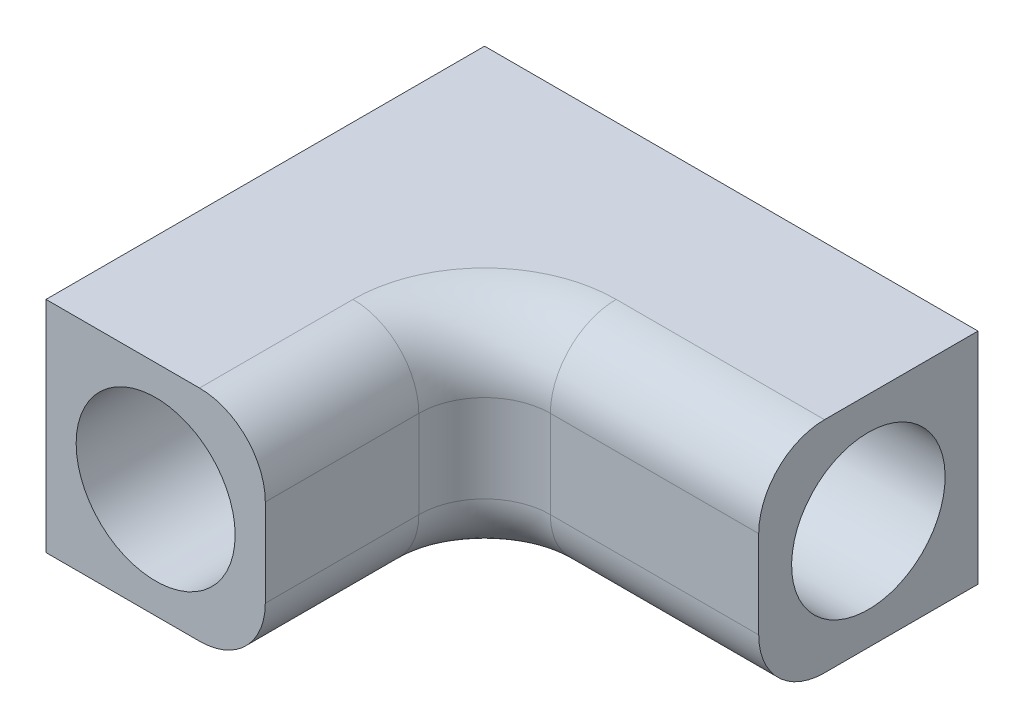
ISO-10303-21;
HEADER;
FILE_DESCRIPTION(('STEP AP214'),'2;1');
FILE_NAME('part.step','',(''),(''),'','','');
FILE_SCHEMA(('AUTOMOTIVE_DESIGN { 1 0 10303 214 1 1 1 1 }'));
ENDSEC;
DATA;
#1=APPLICATION_CONTEXT('core data for automotive mechanical design processes');
#2=APPLICATION_PROTOCOL_DEFINITION('international standard','automotive_design',2000,#1);
#3=PRODUCT_CONTEXT('',#1,'mechanical');
#4=PRODUCT('Part','Part','',(#3));
#5=PRODUCT_RELATED_PRODUCT_CATEGORY('part','',(#4));
#6=PRODUCT_DEFINITION_FORMATION('','',#4);
#7=PRODUCT_DEFINITION_CONTEXT('part definition',#1,'design');
#8=PRODUCT_DEFINITION('design','',#6,#7);
#9=PRODUCT_DEFINITION_SHAPE('','',#8);
#10=(LENGTH_UNIT() NAMED_UNIT(*) SI_UNIT(.MILLI.,.METRE.));
#11=(NAMED_UNIT(*) PLANE_ANGLE_UNIT() SI_UNIT($,.RADIAN.));
#12=(NAMED_UNIT(*) SI_UNIT($,.STERADIAN.) SOLID_ANGLE_UNIT());
#13=UNCERTAINTY_MEASURE_WITH_UNIT(LENGTH_MEASURE(1.E-05),#10,'distance_accuracy_value','');
#14=(GEOMETRIC_REPRESENTATION_CONTEXT(3) GLOBAL_UNCERTAINTY_ASSIGNED_CONTEXT((#13)) GLOBAL_UNIT_ASSIGNED_CONTEXT((#10,
#11,#12)) REPRESENTATION_CONTEXT('',''));
#15=CARTESIAN_POINT('',(0.,0.,0.));
#16=DIRECTION('',(0.,0.,1.));
#17=DIRECTION('',(1.,0.,0.));
#18=AXIS2_PLACEMENT_3D('',#15,#16,#17);
#19=CARTESIAN_POINT('',(-26.9705627484772,0.,10.));
#20=DIRECTION('',(1.,0.,0.));
#21=DIRECTION('',(0.,1.,0.));
#22=AXIS2_PLACEMENT_3D('',#19,#20,#21);
#23=CYLINDRICAL_SURFACE('',#22,6.);
#24=CARTESIAN_POINT('',(-9.,0.,10.));
#25=DIRECTION('',(1.,0.,0.));
#26=DIRECTION('',(0.,1.,0.));
#27=AXIS2_PLACEMENT_3D('',#24,#25,#26);
#28=CIRCLE('',#27,6.);
#29=CARTESIAN_POINT('',(-9.,6.,10.));
#30=VERTEX_POINT('',#29);
#31=EDGE_CURVE('E134',#30,#30,#28,.F.);
#32=ORIENTED_EDGE('',*,*,#31,.T.);
#33=EDGE_LOOP('',(#32));
#34=FACE_BOUND('',#33,.T.);
#35=CARTESIAN_POINT('',(0.,0.,10.));
#36=DIRECTION('',(-0.707106781186547,0.,0.707106781186548));
#37=DIRECTION('',(0.707106781186547,0.,0.707106781186548));
#38=AXIS2_PLACEMENT_3D('',#35,#36,#37);
#39=ELLIPSE('',#38,8.48528137423857,6.);
#40=CARTESIAN_POINT('',(0.,6.,10.));
#41=VERTEX_POINT('',#40);
#42=CARTESIAN_POINT('',(0.,-6.,10.));
#43=VERTEX_POINT('',#42);
#44=EDGE_CURVE('E125',#41,#43,#39,.F.);
#45=ORIENTED_EDGE('',*,*,#44,.F.);
#46=CARTESIAN_POINT('',(0.,0.,10.));
#47=DIRECTION('',(0.707106781186547,0.,0.707106781186548));
#48=DIRECTION('',(-0.707106781186547,0.,0.707106781186548));
#49=AXIS2_PLACEMENT_3D('',#46,#47,#48);
#50=ELLIPSE('',#49,8.48528137423857,6.);
#51=EDGE_CURVE('E129',#43,#41,#50,.F.);
#52=ORIENTED_EDGE('',*,*,#51,.F.);
#53=EDGE_LOOP('',(#45,#52));
#54=FACE_BOUND('',#53,.T.);
#55=CARTESIAN_POINT('',(15.,0.,10.));
#56=DIRECTION('',(1.,0.,0.));
#57=DIRECTION('',(0.,1.,0.));
#58=AXIS2_PLACEMENT_3D('',#55,#56,#57);
#59=CIRCLE('',#58,6.);
#60=CARTESIAN_POINT('',(15.,6.,10.));
#61=VERTEX_POINT('',#60);
#62=EDGE_CURVE('E180',#61,#61,#59,.F.);
#63=ORIENTED_EDGE('',*,*,#62,.F.);
#64=EDGE_LOOP('',(#63));
#65=FACE_BOUND('',#64,.T.);
#66=ADVANCED_FACE('F37',(#34,#54,#65),#23,.F.);
#67=CARTESIAN_POINT('',(0.,0.,-0.001000000000001));
#68=DIRECTION('',(0.,0.,1.));
#69=DIRECTION('',(1.,0.,0.));
#70=AXIS2_PLACEMENT_3D('',#67,#68,#69);
#71=CYLINDRICAL_SURFACE('',#70,6.);
#72=ORIENTED_EDGE('',*,*,#51,.T.);
#73=ORIENTED_EDGE('',*,*,#44,.T.);
#74=EDGE_LOOP('',(#72,#73));
#75=FACE_BOUND('',#74,.T.);
#76=CARTESIAN_POINT('',(0.,0.,20.));
#77=DIRECTION('',(0.,0.,1.));
#78=DIRECTION('',(1.,0.,0.));
#79=AXIS2_PLACEMENT_3D('',#76,#77,#78);
#80=CIRCLE('',#79,6.);
#81=CARTESIAN_POINT('',(6.,0.,20.));
#82=VERTEX_POINT('',#81);
#83=EDGE_CURVE('E131',#82,#82,#80,.F.);
#84=ORIENTED_EDGE('',*,*,#83,.F.);
#85=EDGE_LOOP('',(#84));
#86=FACE_BOUND('',#85,.T.);
#87=ADVANCED_FACE('F127',(#75,#86),#71,.F.);
#88=CARTESIAN_POINT('',(10.,10.,40.));
#89=DIRECTION('',(-1.,0.,0.));
#90=DIRECTION('',(0.,-1.,0.));
#91=AXIS2_PLACEMENT_3D('',#88,#89,#90);
#92=PLANE('',#91);
#93=DIRECTION('',(0.,-1.,0.));
#94=VECTOR('',#93,1.);
#95=CARTESIAN_POINT('',(10.,9.99999999999999,26.));
#96=LINE('',#95,#94);
#97=CARTESIAN_POINT('',(10.,-4.,26.));
#98=VERTEX_POINT('',#97);
#99=CARTESIAN_POINT('',(10.,4.,26.));
#100=VERTEX_POINT('',#99);
#101=EDGE_CURVE('E192',#98,#100,#96,.F.);
#102=ORIENTED_EDGE('',*,*,#101,.T.);
#103=DIRECTION('',(0.,0.,-1.));
#104=VECTOR('',#103,1.);
#105=CARTESIAN_POINT('',(10.,4.,40.));
#106=LINE('',#105,#104);
#107=CARTESIAN_POINT('',(10.,4.,40.));
#108=VERTEX_POINT('',#107);
#109=EDGE_CURVE('E194',#100,#108,#106,.F.);
#110=ORIENTED_EDGE('',*,*,#109,.T.);
#111=DIRECTION('',(0.,1.,0.));
#112=VECTOR('',#111,1.);
#113=CARTESIAN_POINT('',(10.,10.,40.));
#114=LINE('',#113,#112);
#115=CARTESIAN_POINT('',(10.,-4.,40.));
#116=VERTEX_POINT('',#115);
#117=EDGE_CURVE('E154',#116,#108,#114,.T.);
#118=ORIENTED_EDGE('',*,*,#117,.F.);
#119=DIRECTION('',(0.,0.,-1.));
#120=VECTOR('',#119,1.);
#121=CARTESIAN_POINT('',(10.,-4.,40.));
#122=LINE('',#121,#120);
#123=EDGE_CURVE('E190',#116,#98,#122,.T.);
#124=ORIENTED_EDGE('',*,*,#123,.T.);
#125=EDGE_LOOP('',(#102,#110,#118,#124));
#126=FACE_BOUND('',#125,.T.);
#127=ADVANCED_FACE('F288',(#126),#92,.F.);
#128=CARTESIAN_POINT('',(-10.,10.,40.));
#129=DIRECTION('',(0.,-1.,0.));
#130=DIRECTION('',(0.,0.,-1.));
#131=AXIS2_PLACEMENT_3D('',#128,#129,#130);
#132=PLANE('',#131);
#133=DIRECTION('',(-1.,0.,0.));
#134=VECTOR('',#133,1.);
#135=CARTESIAN_POINT('',(-10.,10.,40.));
#136=LINE('',#135,#134);
#137=CARTESIAN_POINT('',(4.,10.,40.));
#138=VERTEX_POINT('',#137);
#139=CARTESIAN_POINT('',(-10.,10.,40.));
#140=VERTEX_POINT('',#139);
#141=EDGE_CURVE('E157',#138,#140,#136,.T.);
#142=ORIENTED_EDGE('',*,*,#141,.F.);
#143=DIRECTION('',(0.,0.,-1.));
#144=VECTOR('',#143,1.);
#145=CARTESIAN_POINT('',(4.,10.,40.));
#146=LINE('',#145,#144);
#147=CARTESIAN_POINT('',(4.,10.,26.));
#148=VERTEX_POINT('',#147);
#149=EDGE_CURVE('E201',#138,#148,#146,.T.);
#150=ORIENTED_EDGE('',*,*,#149,.T.);
#151=CARTESIAN_POINT('',(16.,10.,26.));
#152=DIRECTION('',(0.,-1.,0.));
#153=DIRECTION('',(0.,0.,-1.));
#154=AXIS2_PLACEMENT_3D('',#151,#152,#153);
#155=CIRCLE('',#154,12.);
#156=CARTESIAN_POINT('',(16.,10.,14.));
#157=VERTEX_POINT('',#156);
#158=EDGE_CURVE('E198',#157,#148,#155,.F.);
#159=ORIENTED_EDGE('',*,*,#158,.F.);
#160=DIRECTION('',(-1.,0.,0.));
#161=VECTOR('',#160,1.);
#162=CARTESIAN_POINT('',(-10.,10.,14.));
#163=LINE('',#162,#161);
#164=CARTESIAN_POINT('',(35.,10.,14.));
#165=VERTEX_POINT('',#164);
#166=EDGE_CURVE('E196',#157,#165,#163,.F.);
#167=ORIENTED_EDGE('',*,*,#166,.T.);
#168=DIRECTION('',(0.,0.,1.));
#169=VECTOR('',#168,1.);
#170=CARTESIAN_POINT('',(35.,10.,20.));
#171=LINE('',#170,#169);
#172=CARTESIAN_POINT('',(35.,10.,0.));
#173=VERTEX_POINT('',#172);
#174=EDGE_CURVE('E145',#173,#165,#171,.T.);
#175=ORIENTED_EDGE('',*,*,#174,.F.);
#176=DIRECTION('',(-1.,0.,0.));
#177=VECTOR('',#176,1.);
#178=CARTESIAN_POINT('',(-10.,10.,0.));
#179=LINE('',#178,#177);
#180=CARTESIAN_POINT('',(-10.,10.,0.));
#181=VERTEX_POINT('',#180);
#182=EDGE_CURVE('E153',#173,#181,#179,.T.);
#183=ORIENTED_EDGE('',*,*,#182,.T.);
#184=DIRECTION('',(0.,0.,-1.));
#185=VECTOR('',#184,1.);
#186=CARTESIAN_POINT('',(-10.,10.,40.));
#187=LINE('',#186,#185);
#188=EDGE_CURVE('E173',#140,#181,#187,.T.);
#189=ORIENTED_EDGE('',*,*,#188,.F.);
#190=EDGE_LOOP('',(#142,#150,#159,#167,#175,#183,#189));
#191=FACE_BOUND('',#190,.T.);
#192=ADVANCED_FACE('F267',(#191),#132,.F.);
#193=CARTESIAN_POINT('',(-10.,10.,40.));
#194=DIRECTION('',(1.,0.,0.));
#195=DIRECTION('',(0.,1.,0.));
#196=AXIS2_PLACEMENT_3D('',#193,#194,#195);
#197=PLANE('',#196);
#198=CARTESIAN_POINT('',(-10.,0.,10.));
#199=DIRECTION('',(-1.,0.,0.));
#200=DIRECTION('',(0.,-1.,0.));
#201=AXIS2_PLACEMENT_3D('',#198,#199,#200);
#202=CIRCLE('',#201,4.);
#203=CARTESIAN_POINT('',(-10.,-4.,10.));
#204=VERTEX_POINT('',#203);
#205=EDGE_CURVE('E229',#204,#204,#202,.T.);
#206=ORIENTED_EDGE('',*,*,#205,.F.);
#207=EDGE_LOOP('',(#206));
#208=FACE_BOUND('',#207,.T.);
#209=DIRECTION('',(0.,-1.,0.));
#210=VECTOR('',#209,1.);
#211=CARTESIAN_POINT('',(-10.,10.,0.));
#212=LINE('',#211,#210);
#213=CARTESIAN_POINT('',(-10.,-10.,0.));
#214=VERTEX_POINT('',#213);
#215=EDGE_CURVE('E167',#181,#214,#212,.T.);
#216=ORIENTED_EDGE('',*,*,#215,.T.);
#217=DIRECTION('',(0.,0.,-1.));
#218=VECTOR('',#217,1.);
#219=CARTESIAN_POINT('',(-10.,-10.,40.));
#220=LINE('',#219,#218);
#221=CARTESIAN_POINT('',(-10.,-10.,40.));
#222=VERTEX_POINT('',#221);
#223=EDGE_CURVE('E165',#222,#214,#220,.T.);
#224=ORIENTED_EDGE('',*,*,#223,.F.);
#225=DIRECTION('',(0.,-1.,0.));
#226=VECTOR('',#225,1.);
#227=CARTESIAN_POINT('',(-10.,10.,40.));
#228=LINE('',#227,#226);
#229=EDGE_CURVE('E160',#140,#222,#228,.T.);
#230=ORIENTED_EDGE('',*,*,#229,.F.);
#231=ORIENTED_EDGE('',*,*,#188,.T.);
#232=EDGE_LOOP('',(#216,#224,#230,#231));
#233=FACE_BOUND('',#232,.T.);
#234=ADVANCED_FACE('F274',(#208,#233),#197,.F.);
#235=CARTESIAN_POINT('',(-10.,-10.,40.));
#236=DIRECTION('',(0.,1.,0.));
#237=DIRECTION('',(0.,0.,1.));
#238=AXIS2_PLACEMENT_3D('',#235,#236,#237);
#239=PLANE('',#238);
#240=CARTESIAN_POINT('',(16.,-10.,26.));
#241=DIRECTION('',(0.,1.,0.));
#242=DIRECTION('',(0.,0.,1.));
#243=AXIS2_PLACEMENT_3D('',#240,#241,#242);
#244=CIRCLE('',#243,12.);
#245=CARTESIAN_POINT('',(4.,-10.,26.));
#246=VERTEX_POINT('',#245);
#247=CARTESIAN_POINT('',(16.,-10.,14.));
#248=VERTEX_POINT('',#247);
#249=EDGE_CURVE('E57',#246,#248,#244,.F.);
#250=ORIENTED_EDGE('',*,*,#249,.F.);
#251=DIRECTION('',(0.,0.,-1.));
#252=VECTOR('',#251,1.);
#253=CARTESIAN_POINT('',(4.,-10.,40.));
#254=LINE('',#253,#252);
#255=CARTESIAN_POINT('',(4.,-10.,40.));
#256=VERTEX_POINT('',#255);
#257=EDGE_CURVE('E209',#246,#256,#254,.F.);
#258=ORIENTED_EDGE('',*,*,#257,.T.);
#259=DIRECTION('',(1.,0.,0.));
#260=VECTOR('',#259,1.);
#261=CARTESIAN_POINT('',(-10.,-10.,40.));
#262=LINE('',#261,#260);
#263=EDGE_CURVE('E162',#222,#256,#262,.T.);
#264=ORIENTED_EDGE('',*,*,#263,.F.);
#265=ORIENTED_EDGE('',*,*,#223,.T.);
#266=DIRECTION('',(1.,0.,0.));
#267=VECTOR('',#266,1.);
#268=CARTESIAN_POINT('',(-10.,-10.,0.));
#269=LINE('',#268,#267);
#270=CARTESIAN_POINT('',(35.,-10.,0.));
#271=VERTEX_POINT('',#270);
#272=EDGE_CURVE('E158',#214,#271,#269,.T.);
#273=ORIENTED_EDGE('',*,*,#272,.T.);
#274=DIRECTION('',(0.,0.,-1.));
#275=VECTOR('',#274,1.);
#276=CARTESIAN_POINT('',(35.,-10.,20.));
#277=LINE('',#276,#275);
#278=CARTESIAN_POINT('',(35.,-10.,14.));
#279=VERTEX_POINT('',#278);
#280=EDGE_CURVE('E151',#279,#271,#277,.T.);
#281=ORIENTED_EDGE('',*,*,#280,.F.);
#282=DIRECTION('',(-1.,0.,0.));
#283=VECTOR('',#282,1.);
#284=CARTESIAN_POINT('',(-10.,-10.,14.));
#285=LINE('',#284,#283);
#286=EDGE_CURVE('E52',#279,#248,#285,.T.);
#287=ORIENTED_EDGE('',*,*,#286,.T.);
#288=EDGE_LOOP('',(#250,#258,#264,#265,#273,#281,#287));
#289=FACE_BOUND('',#288,.T.);
#290=ADVANCED_FACE('F254',(#289),#239,.F.);
#291=CARTESIAN_POINT('',(0.,0.,40.));
#292=DIRECTION('',(0.,0.,1.));
#293=DIRECTION('',(1.,0.,0.));
#294=AXIS2_PLACEMENT_3D('',#291,#292,#293);
#295=PLANE('',#294);
#296=CARTESIAN_POINT('',(0.,0.,40.));
#297=DIRECTION('',(0.,0.,1.));
#298=DIRECTION('',(1.,0.,0.));
#299=AXIS2_PLACEMENT_3D('',#296,#297,#298);
#300=CIRCLE('',#299,7.25);
#301=CARTESIAN_POINT('',(7.25,0.,40.));
#302=VERTEX_POINT('',#301);
#303=EDGE_CURVE('E140',#302,#302,#300,.T.);
#304=ORIENTED_EDGE('',*,*,#303,.F.);
#305=EDGE_LOOP('',(#304));
#306=FACE_BOUND('',#305,.T.);
#307=ORIENTED_EDGE('',*,*,#117,.T.);
#308=CARTESIAN_POINT('',(4.,4.,40.));
#309=DIRECTION('',(0.,0.,1.));
#310=DIRECTION('',(1.,0.,0.));
#311=AXIS2_PLACEMENT_3D('',#308,#309,#310);
#312=CIRCLE('',#311,6.);
#313=EDGE_CURVE('E205',#108,#138,#312,.T.);
#314=ORIENTED_EDGE('',*,*,#313,.T.);
#315=ORIENTED_EDGE('',*,*,#141,.T.);
#316=ORIENTED_EDGE('',*,*,#229,.T.);
#317=ORIENTED_EDGE('',*,*,#263,.T.);
#318=CARTESIAN_POINT('',(4.,-4.,40.));
#319=DIRECTION('',(0.,0.,1.));
#320=DIRECTION('',(1.,0.,0.));
#321=AXIS2_PLACEMENT_3D('',#318,#319,#320);
#322=CIRCLE('',#321,6.);
#323=EDGE_CURVE('E203',#256,#116,#322,.T.);
#324=ORIENTED_EDGE('',*,*,#323,.T.);
#325=EDGE_LOOP('',(#307,#314,#315,#316,#317,#324));
#326=FACE_BOUND('',#325,.T.);
#327=ADVANCED_FACE('F250',(#306,#326),#295,.T.);
#328=CARTESIAN_POINT('',(0.,0.,0.));
#329=DIRECTION('',(0.,0.,1.));
#330=DIRECTION('',(1.,0.,0.));
#331=AXIS2_PLACEMENT_3D('',#328,#329,#330);
#332=PLANE('',#331);
#333=ORIENTED_EDGE('',*,*,#182,.F.);
#334=DIRECTION('',(0.,1.,0.));
#335=VECTOR('',#334,1.);
#336=CARTESIAN_POINT('',(35.,10.,0.));
#337=LINE('',#336,#335);
#338=EDGE_CURVE('E137',#271,#173,#337,.T.);
#339=ORIENTED_EDGE('',*,*,#338,.F.);
#340=ORIENTED_EDGE('',*,*,#272,.F.);
#341=ORIENTED_EDGE('',*,*,#215,.F.);
#342=EDGE_LOOP('',(#333,#339,#340,#341));
#343=FACE_BOUND('',#342,.T.);
#344=ADVANCED_FACE('F253',(#343),#332,.F.);
#345=CARTESIAN_POINT('',(35.,10.,20.));
#346=DIRECTION('',(0.,0.,-1.));
#347=DIRECTION('',(0.,1.,0.));
#348=AXIS2_PLACEMENT_3D('',#345,#346,#347);
#349=PLANE('',#348);
#350=DIRECTION('',(0.,-1.,0.));
#351=VECTOR('',#350,1.);
#352=CARTESIAN_POINT('',(16.,-10.,20.));
#353=LINE('',#352,#351);
#354=CARTESIAN_POINT('',(16.,4.,20.));
#355=VERTEX_POINT('',#354);
#356=CARTESIAN_POINT('',(16.,-4.,20.));
#357=VERTEX_POINT('',#356);
#358=EDGE_CURVE('E185',#355,#357,#353,.T.);
#359=ORIENTED_EDGE('',*,*,#358,.T.);
#360=DIRECTION('',(-1.,0.,0.));
#361=VECTOR('',#360,1.);
#362=CARTESIAN_POINT('',(35.,-4.,20.));
#363=LINE('',#362,#361);
#364=CARTESIAN_POINT('',(35.,-4.,20.));
#365=VERTEX_POINT('',#364);
#366=EDGE_CURVE('E188',#357,#365,#363,.F.);
#367=ORIENTED_EDGE('',*,*,#366,.T.);
#368=DIRECTION('',(0.,-1.,0.));
#369=VECTOR('',#368,1.);
#370=CARTESIAN_POINT('',(35.,10.,20.));
#371=LINE('',#370,#369);
#372=CARTESIAN_POINT('',(35.,4.,20.));
#373=VERTEX_POINT('',#372);
#374=EDGE_CURVE('E148',#373,#365,#371,.T.);
#375=ORIENTED_EDGE('',*,*,#374,.F.);
#376=DIRECTION('',(-1.,0.,0.));
#377=VECTOR('',#376,1.);
#378=CARTESIAN_POINT('',(35.,4.,20.));
#379=LINE('',#378,#377);
#380=EDGE_CURVE('E176',#373,#355,#379,.T.);
#381=ORIENTED_EDGE('',*,*,#380,.T.);
#382=EDGE_LOOP('',(#359,#367,#375,#381));
#383=FACE_BOUND('',#382,.T.);
#384=ADVANCED_FACE('F309',(#383),#349,.F.);
#385=CARTESIAN_POINT('',(35.,0.,0.));
#386=DIRECTION('',(1.,0.,0.));
#387=DIRECTION('',(0.,1.,0.));
#388=AXIS2_PLACEMENT_3D('',#385,#386,#387);
#389=PLANE('',#388);
#390=CARTESIAN_POINT('',(35.,0.,10.));
#391=DIRECTION('',(1.,0.,0.));
#392=DIRECTION('',(0.,1.,0.));
#393=AXIS2_PLACEMENT_3D('',#390,#391,#392);
#394=CIRCLE('',#393,7.);
#395=CARTESIAN_POINT('',(35.,7.00000000000001,10.));
#396=VERTEX_POINT('',#395);
#397=EDGE_CURVE('E234',#396,#396,#394,.T.);
#398=ORIENTED_EDGE('',*,*,#397,.F.);
#399=EDGE_LOOP('',(#398));
#400=FACE_BOUND('',#399,.T.);
#401=ORIENTED_EDGE('',*,*,#374,.T.);
#402=CARTESIAN_POINT('',(35.,-4.,14.));
#403=DIRECTION('',(1.,0.,0.));
#404=DIRECTION('',(0.,1.,0.));
#405=AXIS2_PLACEMENT_3D('',#402,#403,#404);
#406=CIRCLE('',#405,6.);
#407=EDGE_CURVE('E45',#365,#279,#406,.T.);
#408=ORIENTED_EDGE('',*,*,#407,.T.);
#409=ORIENTED_EDGE('',*,*,#280,.T.);
#410=ORIENTED_EDGE('',*,*,#338,.T.);
#411=ORIENTED_EDGE('',*,*,#174,.T.);
#412=CARTESIAN_POINT('',(35.,4.,14.));
#413=DIRECTION('',(1.,0.,0.));
#414=DIRECTION('',(0.,1.,0.));
#415=AXIS2_PLACEMENT_3D('',#412,#413,#414);
#416=CIRCLE('',#415,6.);
#417=EDGE_CURVE('E211',#165,#373,#416,.T.);
#418=ORIENTED_EDGE('',*,*,#417,.T.);
#419=EDGE_LOOP('',(#401,#408,#409,#410,#411,#418));
#420=FACE_BOUND('',#419,.T.);
#421=ADVANCED_FACE('F306',(#400,#420),#389,.T.);
#422=CARTESIAN_POINT('',(-9.,10.,40.));
#423=DIRECTION('',(1.,0.,0.));
#424=DIRECTION('',(0.,1.,0.));
#425=AXIS2_PLACEMENT_3D('',#422,#423,#424);
#426=PLANE('',#425);
#427=CARTESIAN_POINT('',(-9.,0.,10.));
#428=DIRECTION('',(1.,0.,0.));
#429=DIRECTION('',(0.,1.,0.));
#430=AXIS2_PLACEMENT_3D('',#427,#428,#429);
#431=CIRCLE('',#430,5.);
#432=CARTESIAN_POINT('',(-9.,5.,10.));
#433=VERTEX_POINT('',#432);
#434=EDGE_CURVE('E12',#433,#433,#431,.F.);
#435=ORIENTED_EDGE('',*,*,#434,.T.);
#436=EDGE_LOOP('',(#435));
#437=FACE_BOUND('',#436,.T.);
#438=ORIENTED_EDGE('',*,*,#31,.F.);
#439=EDGE_LOOP('',(#438));
#440=FACE_BOUND('',#439,.T.);
#441=ADVANCED_FACE('F305',(#437,#440),#426,.T.);
#442=CARTESIAN_POINT('',(0.,0.,20.));
#443=DIRECTION('',(0.,0.,1.));
#444=DIRECTION('',(1.,0.,0.));
#445=AXIS2_PLACEMENT_3D('',#442,#443,#444);
#446=PLANE('',#445);
#447=CARTESIAN_POINT('',(0.,0.,20.));
#448=DIRECTION('',(0.,0.,1.));
#449=DIRECTION('',(1.,0.,0.));
#450=AXIS2_PLACEMENT_3D('',#447,#448,#449);
#451=CIRCLE('',#450,7.25);
#452=CARTESIAN_POINT('',(7.25,0.,20.));
#453=VERTEX_POINT('',#452);
#454=EDGE_CURVE('E179',#453,#453,#451,.T.);
#455=ORIENTED_EDGE('',*,*,#454,.T.);
#456=EDGE_LOOP('',(#455));
#457=FACE_BOUND('',#456,.T.);
#458=ORIENTED_EDGE('',*,*,#83,.T.);
#459=EDGE_LOOP('',(#458));
#460=FACE_BOUND('',#459,.T.);
#461=ADVANCED_FACE('F354',(#457,#460),#446,.T.);
#462=CARTESIAN_POINT('',(0.,0.,20.));
#463=DIRECTION('',(0.,0.,1.));
#464=DIRECTION('',(1.,0.,0.));
#465=AXIS2_PLACEMENT_3D('',#462,#463,#464);
#466=CYLINDRICAL_SURFACE('',#465,7.25);
#467=ORIENTED_EDGE('',*,*,#454,.F.);
#468=EDGE_LOOP('',(#467));
#469=FACE_BOUND('',#468,.T.);
#470=ORIENTED_EDGE('',*,*,#303,.T.);
#471=EDGE_LOOP('',(#470));
#472=FACE_BOUND('',#471,.T.);
#473=ADVANCED_FACE('F248',(#469,#472),#466,.F.);
#474=CARTESIAN_POINT('',(15.,0.,10.));
#475=DIRECTION('',(1.,0.,0.));
#476=DIRECTION('',(0.,1.,0.));
#477=AXIS2_PLACEMENT_3D('',#474,#475,#476);
#478=PLANE('',#477);
#479=CARTESIAN_POINT('',(15.,0.,10.));
#480=DIRECTION('',(1.,0.,0.));
#481=DIRECTION('',(0.,1.,0.));
#482=AXIS2_PLACEMENT_3D('',#479,#480,#481);
#483=CIRCLE('',#482,7.);
#484=CARTESIAN_POINT('',(15.,7.,10.));
#485=VERTEX_POINT('',#484);
#486=EDGE_CURVE('E183',#485,#485,#483,.T.);
#487=ORIENTED_EDGE('',*,*,#486,.T.);
#488=EDGE_LOOP('',(#487));
#489=FACE_BOUND('',#488,.T.);
#490=ORIENTED_EDGE('',*,*,#62,.T.);
#491=EDGE_LOOP('',(#490));
#492=FACE_BOUND('',#491,.T.);
#493=ADVANCED_FACE('F369',(#489,#492),#478,.T.);
#494=CARTESIAN_POINT('',(15.,0.,10.));
#495=DIRECTION('',(1.,0.,0.));
#496=DIRECTION('',(0.,1.,0.));
#497=AXIS2_PLACEMENT_3D('',#494,#495,#496);
#498=CYLINDRICAL_SURFACE('',#497,7.);
#499=ORIENTED_EDGE('',*,*,#486,.F.);
#500=EDGE_LOOP('',(#499));
#501=FACE_BOUND('',#500,.T.);
#502=ORIENTED_EDGE('',*,*,#397,.T.);
#503=EDGE_LOOP('',(#502));
#504=FACE_BOUND('',#503,.T.);
#505=ADVANCED_FACE('F377',(#501,#504),#498,.F.);
#506=CARTESIAN_POINT('',(4.,4.,40.));
#507=DIRECTION('',(0.,0.,-1.));
#508=DIRECTION('',(-1.,0.,0.));
#509=AXIS2_PLACEMENT_3D('',#506,#507,#508);
#510=CYLINDRICAL_SURFACE('',#509,6.);
#511=ORIENTED_EDGE('',*,*,#313,.F.);
#512=ORIENTED_EDGE('',*,*,#109,.F.);
#513=CARTESIAN_POINT('',(4.,4.,26.));
#514=DIRECTION('',(0.,0.,-1.));
#515=DIRECTION('',(-1.,0.,0.));
#516=AXIS2_PLACEMENT_3D('',#513,#514,#515);
#517=CIRCLE('',#516,6.);
#518=EDGE_CURVE('E227',#148,#100,#517,.T.);
#519=ORIENTED_EDGE('',*,*,#518,.F.);
#520=ORIENTED_EDGE('',*,*,#149,.F.);
#521=EDGE_LOOP('',(#511,#512,#519,#520));
#522=FACE_BOUND('',#521,.T.);
#523=ADVANCED_FACE('F265',(#522),#510,.T.);
#524=CARTESIAN_POINT('',(35.,4.,14.));
#525=DIRECTION('',(-1.,0.,0.));
#526=DIRECTION('',(0.,0.,1.));
#527=AXIS2_PLACEMENT_3D('',#524,#525,#526);
#528=CYLINDRICAL_SURFACE('',#527,6.);
#529=ORIENTED_EDGE('',*,*,#417,.F.);
#530=ORIENTED_EDGE('',*,*,#166,.F.);
#531=CARTESIAN_POINT('',(16.,4.,14.));
#532=DIRECTION('',(-1.,0.,0.));
#533=DIRECTION('',(0.,0.,1.));
#534=AXIS2_PLACEMENT_3D('',#531,#532,#533);
#535=CIRCLE('',#534,6.);
#536=EDGE_CURVE('E225',#355,#157,#535,.T.);
#537=ORIENTED_EDGE('',*,*,#536,.F.);
#538=ORIENTED_EDGE('',*,*,#380,.F.);
#539=EDGE_LOOP('',(#529,#530,#537,#538));
#540=FACE_BOUND('',#539,.T.);
#541=ADVANCED_FACE('F390',(#540),#528,.T.);
#542=CARTESIAN_POINT('',(-10.,-4.,14.));
#543=DIRECTION('',(-1.,0.,0.));
#544=DIRECTION('',(0.,0.,1.));
#545=AXIS2_PLACEMENT_3D('',#542,#543,#544);
#546=CYLINDRICAL_SURFACE('',#545,6.);
#547=ORIENTED_EDGE('',*,*,#407,.F.);
#548=ORIENTED_EDGE('',*,*,#366,.F.);
#549=CARTESIAN_POINT('',(16.,-4.,14.));
#550=DIRECTION('',(-1.,0.,0.));
#551=DIRECTION('',(0.,0.,1.));
#552=AXIS2_PLACEMENT_3D('',#549,#550,#551);
#553=CIRCLE('',#552,6.);
#554=EDGE_CURVE('E222',#248,#357,#553,.T.);
#555=ORIENTED_EDGE('',*,*,#554,.F.);
#556=ORIENTED_EDGE('',*,*,#286,.F.);
#557=EDGE_LOOP('',(#547,#548,#555,#556));
#558=FACE_BOUND('',#557,.T.);
#559=ADVANCED_FACE('F396',(#558),#546,.T.);
#560=CARTESIAN_POINT('',(4.,-4.,40.));
#561=DIRECTION('',(0.,0.,-1.));
#562=DIRECTION('',(-1.,0.,0.));
#563=AXIS2_PLACEMENT_3D('',#560,#561,#562);
#564=CYLINDRICAL_SURFACE('',#563,6.);
#565=ORIENTED_EDGE('',*,*,#323,.F.);
#566=ORIENTED_EDGE('',*,*,#257,.F.);
#567=CARTESIAN_POINT('',(4.,-4.,26.));
#568=DIRECTION('',(0.,0.,-1.));
#569=DIRECTION('',(-1.,0.,0.));
#570=AXIS2_PLACEMENT_3D('',#567,#568,#569);
#571=CIRCLE('',#570,6.);
#572=EDGE_CURVE('E219',#98,#246,#571,.T.);
#573=ORIENTED_EDGE('',*,*,#572,.F.);
#574=ORIENTED_EDGE('',*,*,#123,.F.);
#575=EDGE_LOOP('',(#565,#566,#573,#574));
#576=FACE_BOUND('',#575,.T.);
#577=ADVANCED_FACE('F279',(#576),#564,.T.);
#578=CARTESIAN_POINT('',(16.,4.,26.));
#579=DIRECTION('',(0.,-1.,0.));
#580=DIRECTION('',(0.,0.,-1.));
#581=AXIS2_PLACEMENT_3D('',#578,#579,#580);
#582=TOROIDAL_SURFACE('',#581,12.,6.);
#583=ORIENTED_EDGE('',*,*,#158,.T.);
#584=ORIENTED_EDGE('',*,*,#518,.T.);
#585=CARTESIAN_POINT('',(16.,4.,26.));
#586=DIRECTION('',(0.,-1.,0.));
#587=DIRECTION('',(0.,0.,-1.));
#588=AXIS2_PLACEMENT_3D('',#585,#586,#587);
#589=CIRCLE('',#588,6.);
#590=EDGE_CURVE('E216',#355,#100,#589,.F.);
#591=ORIENTED_EDGE('',*,*,#590,.F.);
#592=ORIENTED_EDGE('',*,*,#536,.T.);
#593=EDGE_LOOP('',(#583,#584,#591,#592));
#594=FACE_BOUND('',#593,.T.);
#595=ADVANCED_FACE('F411',(#594),#582,.T.);
#596=CARTESIAN_POINT('',(16.,-4.,26.));
#597=DIRECTION('',(0.,1.,0.));
#598=DIRECTION('',(0.,0.,1.));
#599=AXIS2_PLACEMENT_3D('',#596,#597,#598);
#600=TOROIDAL_SURFACE('',#599,12.,6.);
#601=ORIENTED_EDGE('',*,*,#249,.T.);
#602=ORIENTED_EDGE('',*,*,#554,.T.);
#603=CARTESIAN_POINT('',(16.,-4.,26.));
#604=DIRECTION('',(0.,1.,0.));
#605=DIRECTION('',(0.,0.,1.));
#606=AXIS2_PLACEMENT_3D('',#603,#604,#605);
#607=CIRCLE('',#606,6.);
#608=EDGE_CURVE('E214',#98,#357,#607,.F.);
#609=ORIENTED_EDGE('',*,*,#608,.F.);
#610=ORIENTED_EDGE('',*,*,#572,.T.);
#611=EDGE_LOOP('',(#601,#602,#609,#610));
#612=FACE_BOUND('',#611,.T.);
#613=ADVANCED_FACE('F283',(#612),#600,.T.);
#614=CARTESIAN_POINT('',(16.,9.99999999999999,26.));
#615=DIRECTION('',(0.,1.,0.));
#616=DIRECTION('',(-1.,0.,0.));
#617=AXIS2_PLACEMENT_3D('',#614,#615,#616);
#618=CYLINDRICAL_SURFACE('',#617,6.);
#619=ORIENTED_EDGE('',*,*,#590,.T.);
#620=ORIENTED_EDGE('',*,*,#101,.F.);
#621=ORIENTED_EDGE('',*,*,#608,.T.);
#622=ORIENTED_EDGE('',*,*,#358,.F.);
#623=EDGE_LOOP('',(#619,#620,#621,#622));
#624=FACE_BOUND('',#623,.T.);
#625=ADVANCED_FACE('F287',(#624),#618,.F.);
#626=CARTESIAN_POINT('',(-10.,0.,10.));
#627=DIRECTION('',(1.,0.,0.));
#628=DIRECTION('',(0.,1.,0.));
#629=AXIS2_PLACEMENT_3D('',#626,#627,#628);
#630=TOROIDAL_SURFACE('',#629,5.,1.);
#631=ORIENTED_EDGE('',*,*,#205,.T.);
#632=EDGE_LOOP('',(#631));
#633=FACE_BOUND('',#632,.T.);
#634=ORIENTED_EDGE('',*,*,#434,.F.);
#635=EDGE_LOOP('',(#634));
#636=FACE_BOUND('',#635,.T.);
#637=ADVANCED_FACE('F39',(#633,#636),#630,.T.);
#638=CLOSED_SHELL('',(#66,#87,#127,#192,#234,#290,#327,#344,#384,#421,#441,#461,#473,#493,#505,
#523,#541,#559,#577,#595,#613,#625,#637));
#639=MANIFOLD_SOLID_BREP('B2',#638);
#640=ADVANCED_BREP_SHAPE_REPRESENTATION('',(#18,#639),#14);
#641=SHAPE_DEFINITION_REPRESENTATION(#9,#640);
ENDSEC;
END-ISO-10303-21;
